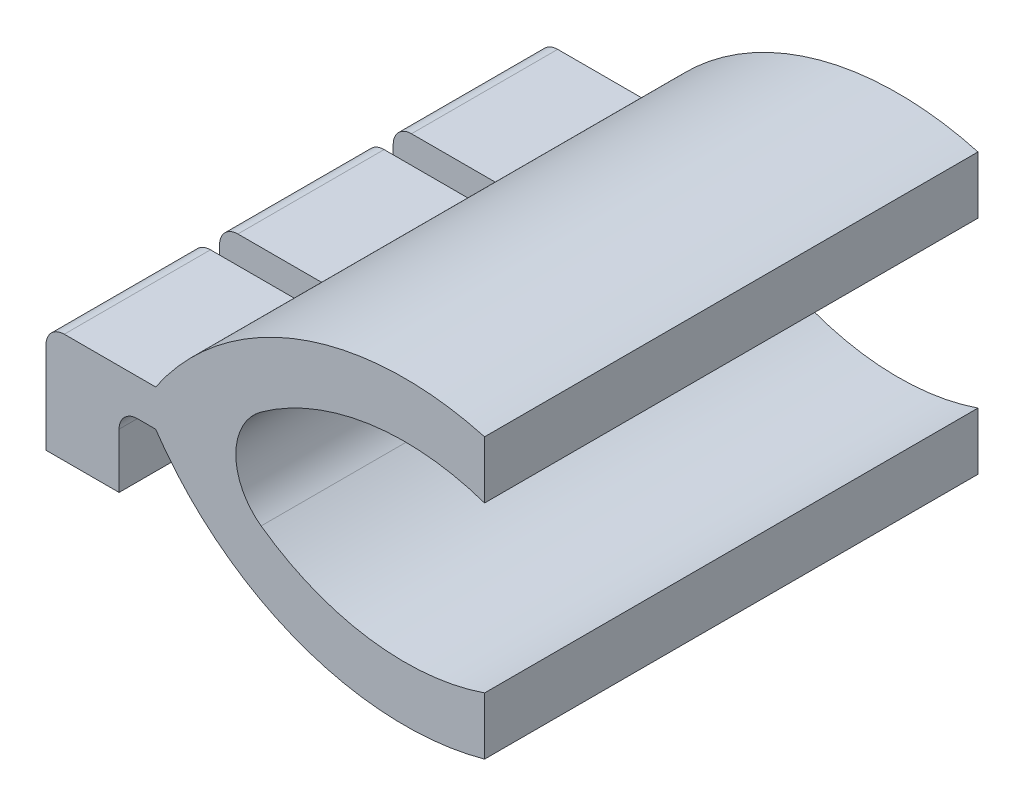
ISO-10303-21;
HEADER;
FILE_DESCRIPTION(('STEP AP214'),'2;1');
FILE_NAME('part.step','',(''),(''),'','','');
FILE_SCHEMA(('AUTOMOTIVE_DESIGN { 1 0 10303 214 1 1 1 1 }'));
ENDSEC;
DATA;
#1=APPLICATION_CONTEXT('core data for automotive mechanical design processes');
#2=APPLICATION_PROTOCOL_DEFINITION('international standard','automotive_design',2000,#1);
#3=PRODUCT_CONTEXT('',#1,'mechanical');
#4=PRODUCT('Part','Part','',(#3));
#5=PRODUCT_RELATED_PRODUCT_CATEGORY('part','',(#4));
#6=PRODUCT_DEFINITION_FORMATION('','',#4);
#7=PRODUCT_DEFINITION_CONTEXT('part definition',#1,'design');
#8=PRODUCT_DEFINITION('design','',#6,#7);
#9=PRODUCT_DEFINITION_SHAPE('','',#8);
#10=(LENGTH_UNIT() NAMED_UNIT(*) SI_UNIT(.MILLI.,.METRE.));
#11=(NAMED_UNIT(*) PLANE_ANGLE_UNIT() SI_UNIT($,.RADIAN.));
#12=(NAMED_UNIT(*) SI_UNIT($,.STERADIAN.) SOLID_ANGLE_UNIT());
#13=UNCERTAINTY_MEASURE_WITH_UNIT(LENGTH_MEASURE(1.E-05),#10,'distance_accuracy_value','');
#14=(GEOMETRIC_REPRESENTATION_CONTEXT(3) GLOBAL_UNCERTAINTY_ASSIGNED_CONTEXT((#13)) GLOBAL_UNIT_ASSIGNED_CONTEXT((#10,
#11,#12)) REPRESENTATION_CONTEXT('',''));
#15=CARTESIAN_POINT('',(0.,0.,0.));
#16=DIRECTION('',(0.,0.,1.));
#17=DIRECTION('',(1.,0.,0.));
#18=AXIS2_PLACEMENT_3D('',#15,#16,#17);
#19=CARTESIAN_POINT('',(-12.734069529105,0.999999999999999,27.));
#20=DIRECTION('',(0.,-1.,0.));
#21=DIRECTION('',(1.,0.,0.));
#22=AXIS2_PLACEMENT_3D('',#19,#20,#21);
#23=PLANE('',#22);
#24=DIRECTION('',(-1.,0.,0.));
#25=VECTOR('',#24,1.);
#26=CARTESIAN_POINT('',(-12.734069529105,0.999999999999999,9.5));
#27=LINE('',#26,#25);
#28=CARTESIAN_POINT('',(-12.734069529105,0.999999999999999,9.5));
#29=VERTEX_POINT('',#28);
#30=CARTESIAN_POINT('',(-17.734069529105,1.,9.5));
#31=VERTEX_POINT('',#30);
#32=EDGE_CURVE('E331',#29,#31,#27,.T.);
#33=ORIENTED_EDGE('',*,*,#32,.T.);
#34=DIRECTION('',(0.,0.,-1.));
#35=VECTOR('',#34,1.);
#36=CARTESIAN_POINT('',(-17.734069529105,1.,27.));
#37=LINE('',#36,#35);
#38=CARTESIAN_POINT('',(-17.734069529105,1.,17.5));
#39=VERTEX_POINT('',#38);
#40=EDGE_CURVE('E461',#31,#39,#37,.F.);
#41=ORIENTED_EDGE('',*,*,#40,.T.);
#42=DIRECTION('',(1.,0.,0.));
#43=VECTOR('',#42,1.);
#44=CARTESIAN_POINT('',(-12.734069529105,0.999999999999999,17.5));
#45=LINE('',#44,#43);
#46=CARTESIAN_POINT('',(-12.734069529105,0.999999999999999,17.5));
#47=VERTEX_POINT('',#46);
#48=EDGE_CURVE('E244',#39,#47,#45,.T.);
#49=ORIENTED_EDGE('',*,*,#48,.T.);
#50=DIRECTION('',(0.,0.,-1.));
#51=VECTOR('',#50,1.);
#52=CARTESIAN_POINT('',(-12.734069529105,0.999999999999999,27.));
#53=LINE('',#52,#51);
#54=EDGE_CURVE('E436',#47,#29,#53,.T.);
#55=ORIENTED_EDGE('',*,*,#54,.T.);
#56=EDGE_LOOP('',(#33,#41,#49,#55));
#57=FACE_BOUND('',#56,.T.);
#58=ADVANCED_FACE('F33',(#57),#23,.F.);
#59=DIRECTION('',(-1.,0.,0.));
#60=VECTOR('',#59,1.);
#61=CARTESIAN_POINT('',(-12.734069529105,0.999999999999999,19.));
#62=LINE('',#61,#60);
#63=CARTESIAN_POINT('',(-12.734069529105,0.999999999999999,19.));
#64=VERTEX_POINT('',#63);
#65=CARTESIAN_POINT('',(-17.734069529105,1.,19.));
#66=VERTEX_POINT('',#65);
#67=EDGE_CURVE('E264',#64,#66,#62,.T.);
#68=ORIENTED_EDGE('',*,*,#67,.T.);
#69=DIRECTION('',(0.,0.,-1.));
#70=VECTOR('',#69,1.);
#71=CARTESIAN_POINT('',(-17.734069529105,1.,27.));
#72=LINE('',#71,#70);
#73=CARTESIAN_POINT('',(-17.734069529105,1.,27.));
#74=VERTEX_POINT('',#73);
#75=EDGE_CURVE('E452',#66,#74,#72,.F.);
#76=ORIENTED_EDGE('',*,*,#75,.T.);
#77=DIRECTION('',(-1.,0.,0.));
#78=VECTOR('',#77,1.);
#79=CARTESIAN_POINT('',(-12.734069529105,0.999999999999999,27.));
#80=LINE('',#79,#78);
#81=CARTESIAN_POINT('',(-12.734069529105,0.999999999999999,27.));
#82=VERTEX_POINT('',#81);
#83=EDGE_CURVE('E351',#82,#74,#80,.T.);
#84=ORIENTED_EDGE('',*,*,#83,.F.);
#85=EDGE_CURVE('E441',#82,#64,#53,.T.);
#86=ORIENTED_EDGE('',*,*,#85,.T.);
#87=EDGE_LOOP('',(#68,#76,#84,#86));
#88=FACE_BOUND('',#87,.T.);
#89=ADVANCED_FACE('F541',(#88),#23,.F.);
#90=CARTESIAN_POINT('',(-18.734069529105,1.,27.));
#91=DIRECTION('',(1.,0.,0.));
#92=DIRECTION('',(0.,1.,0.));
#93=AXIS2_PLACEMENT_3D('',#90,#91,#92);
#94=PLANE('',#93);
#95=DIRECTION('',(0.,-1.,0.));
#96=VECTOR('',#95,1.);
#97=CARTESIAN_POINT('',(-18.734069529105,11.,17.5));
#98=LINE('',#97,#96);
#99=CARTESIAN_POINT('',(-18.734069529105,0.,17.5));
#100=VERTEX_POINT('',#99);
#101=CARTESIAN_POINT('',(-18.734069529105,-5.,17.5));
#102=VERTEX_POINT('',#101);
#103=EDGE_CURVE('E398',#100,#102,#98,.T.);
#104=ORIENTED_EDGE('',*,*,#103,.F.);
#105=DIRECTION('',(0.,0.,-1.));
#106=VECTOR('',#105,1.);
#107=CARTESIAN_POINT('',(-18.734069529105,0.,27.));
#108=LINE('',#107,#106);
#109=CARTESIAN_POINT('',(-18.734069529105,0.,9.5));
#110=VERTEX_POINT('',#109);
#111=EDGE_CURVE('E456',#100,#110,#108,.T.);
#112=ORIENTED_EDGE('',*,*,#111,.T.);
#113=DIRECTION('',(0.,1.,0.));
#114=VECTOR('',#113,1.);
#115=CARTESIAN_POINT('',(-18.734069529105,11.0236569041917,9.5));
#116=LINE('',#115,#114);
#117=CARTESIAN_POINT('',(-18.734069529105,-5.,9.5));
#118=VERTEX_POINT('',#117);
#119=EDGE_CURVE('E401',#118,#110,#116,.T.);
#120=ORIENTED_EDGE('',*,*,#119,.F.);
#121=DIRECTION('',(0.,0.,-1.));
#122=VECTOR('',#121,1.);
#123=CARTESIAN_POINT('',(-18.734069529105,-5.,27.));
#124=LINE('',#123,#122);
#125=EDGE_CURVE('E506',#102,#118,#124,.T.);
#126=ORIENTED_EDGE('',*,*,#125,.F.);
#127=EDGE_LOOP('',(#104,#112,#120,#126));
#128=FACE_BOUND('',#127,.T.);
#129=ADVANCED_FACE('F521',(#128),#94,.F.);
#130=DIRECTION('',(0.,-1.,0.));
#131=VECTOR('',#130,1.);
#132=CARTESIAN_POINT('',(-18.734069529105,1.,27.));
#133=LINE('',#132,#131);
#134=CARTESIAN_POINT('',(-18.734069529105,0.,27.));
#135=VERTEX_POINT('',#134);
#136=CARTESIAN_POINT('',(-18.734069529105,-5.,27.));
#137=VERTEX_POINT('',#136);
#138=EDGE_CURVE('E349',#135,#137,#133,.T.);
#139=ORIENTED_EDGE('',*,*,#138,.F.);
#140=DIRECTION('',(0.,0.,-1.));
#141=VECTOR('',#140,1.);
#142=CARTESIAN_POINT('',(-18.734069529105,0.,27.));
#143=LINE('',#142,#141);
#144=CARTESIAN_POINT('',(-18.734069529105,0.,19.));
#145=VERTEX_POINT('',#144);
#146=EDGE_CURVE('E444',#135,#145,#143,.T.);
#147=ORIENTED_EDGE('',*,*,#146,.T.);
#148=DIRECTION('',(0.,1.,0.));
#149=VECTOR('',#148,1.);
#150=CARTESIAN_POINT('',(-18.734069529105,-9.00000000000001,19.));
#151=LINE('',#150,#149);
#152=CARTESIAN_POINT('',(-18.734069529105,-5.,19.));
#153=VERTEX_POINT('',#152);
#154=EDGE_CURVE('E396',#153,#145,#151,.T.);
#155=ORIENTED_EDGE('',*,*,#154,.F.);
#156=EDGE_CURVE('E445',#137,#153,#124,.T.);
#157=ORIENTED_EDGE('',*,*,#156,.F.);
#158=EDGE_LOOP('',(#139,#147,#155,#157));
#159=FACE_BOUND('',#158,.T.);
#160=ADVANCED_FACE('F559',(#159),#94,.F.);
#161=CARTESIAN_POINT('',(-18.734069529105,-5.,27.));
#162=DIRECTION('',(0.,1.,0.));
#163=DIRECTION('',(0.,0.,1.));
#164=AXIS2_PLACEMENT_3D('',#161,#162,#163);
#165=PLANE('',#164);
#166=ORIENTED_EDGE('',*,*,#125,.T.);
#167=DIRECTION('',(1.,0.,0.));
#168=VECTOR('',#167,1.);
#169=CARTESIAN_POINT('',(-18.734069529105,-5.,9.5));
#170=LINE('',#169,#168);
#171=CARTESIAN_POINT('',(-14.734069529105,-5.,9.5));
#172=VERTEX_POINT('',#171);
#173=EDGE_CURVE('E358',#118,#172,#170,.T.);
#174=ORIENTED_EDGE('',*,*,#173,.T.);
#175=DIRECTION('',(0.,0.,-1.));
#176=VECTOR('',#175,1.);
#177=CARTESIAN_POINT('',(-14.734069529105,-5.,27.));
#178=LINE('',#177,#176);
#179=CARTESIAN_POINT('',(-14.734069529105,-5.,17.5));
#180=VERTEX_POINT('',#179);
#181=EDGE_CURVE('E272',#180,#172,#178,.T.);
#182=ORIENTED_EDGE('',*,*,#181,.F.);
#183=DIRECTION('',(-1.,0.,0.));
#184=VECTOR('',#183,1.);
#185=CARTESIAN_POINT('',(-18.734069529105,-5.,17.5));
#186=LINE('',#185,#184);
#187=EDGE_CURVE('E385',#180,#102,#186,.T.);
#188=ORIENTED_EDGE('',*,*,#187,.T.);
#189=EDGE_LOOP('',(#166,#174,#182,#188));
#190=FACE_BOUND('',#189,.T.);
#191=ADVANCED_FACE('F516',(#190),#165,.F.);
#192=ORIENTED_EDGE('',*,*,#156,.T.);
#193=DIRECTION('',(1.,0.,0.));
#194=VECTOR('',#193,1.);
#195=CARTESIAN_POINT('',(-18.734069529105,-5.,19.));
#196=LINE('',#195,#194);
#197=CARTESIAN_POINT('',(-14.734069529105,-5.,19.));
#198=VERTEX_POINT('',#197);
#199=EDGE_CURVE('E379',#153,#198,#196,.T.);
#200=ORIENTED_EDGE('',*,*,#199,.T.);
#201=CARTESIAN_POINT('',(-14.734069529105,-5.,27.));
#202=VERTEX_POINT('',#201);
#203=EDGE_CURVE('E274',#202,#198,#178,.T.);
#204=ORIENTED_EDGE('',*,*,#203,.F.);
#205=DIRECTION('',(1.,0.,0.));
#206=VECTOR('',#205,1.);
#207=CARTESIAN_POINT('',(-18.734069529105,-5.,27.));
#208=LINE('',#207,#206);
#209=EDGE_CURVE('E347',#137,#202,#208,.T.);
#210=ORIENTED_EDGE('',*,*,#209,.F.);
#211=EDGE_LOOP('',(#192,#200,#204,#210));
#212=FACE_BOUND('',#211,.T.);
#213=ADVANCED_FACE('F503',(#212),#165,.F.);
#214=CARTESIAN_POINT('',(-14.734069529105,-5.,27.));
#215=DIRECTION('',(-1.,0.,0.));
#216=DIRECTION('',(0.,0.,1.));
#217=AXIS2_PLACEMENT_3D('',#214,#215,#216);
#218=PLANE('',#217);
#219=DIRECTION('',(0.,1.,0.));
#220=VECTOR('',#219,1.);
#221=CARTESIAN_POINT('',(-14.734069529105,-5.,9.5));
#222=LINE('',#221,#220);
#223=CARTESIAN_POINT('',(-14.734069529105,-2.,9.5));
#224=VERTEX_POINT('',#223);
#225=EDGE_CURVE('E361',#172,#224,#222,.T.);
#226=ORIENTED_EDGE('',*,*,#225,.T.);
#227=DIRECTION('',(0.,0.,-1.));
#228=VECTOR('',#227,1.);
#229=CARTESIAN_POINT('',(-14.734069529105,-2.,17.5));
#230=LINE('',#229,#228);
#231=CARTESIAN_POINT('',(-14.734069529105,-2.,17.5));
#232=VERTEX_POINT('',#231);
#233=EDGE_CURVE('E478',#224,#232,#230,.F.);
#234=ORIENTED_EDGE('',*,*,#233,.T.);
#235=DIRECTION('',(0.,-1.,0.));
#236=VECTOR('',#235,1.);
#237=CARTESIAN_POINT('',(-14.734069529105,-5.,17.5));
#238=LINE('',#237,#236);
#239=EDGE_CURVE('E388',#232,#180,#238,.T.);
#240=ORIENTED_EDGE('',*,*,#239,.T.);
#241=ORIENTED_EDGE('',*,*,#181,.T.);
#242=EDGE_LOOP('',(#226,#234,#240,#241));
#243=FACE_BOUND('',#242,.T.);
#244=ADVANCED_FACE('F510',(#243),#218,.F.);
#245=DIRECTION('',(0.,1.,0.));
#246=VECTOR('',#245,1.);
#247=CARTESIAN_POINT('',(-14.734069529105,-5.,19.));
#248=LINE('',#247,#246);
#249=CARTESIAN_POINT('',(-14.734069529105,-2.,19.));
#250=VERTEX_POINT('',#249);
#251=EDGE_CURVE('E243',#198,#250,#248,.T.);
#252=ORIENTED_EDGE('',*,*,#251,.T.);
#253=DIRECTION('',(0.,0.,-1.));
#254=VECTOR('',#253,1.);
#255=CARTESIAN_POINT('',(-14.734069529105,-2.,27.));
#256=LINE('',#255,#254);
#257=CARTESIAN_POINT('',(-14.734069529105,-2.,27.));
#258=VERTEX_POINT('',#257);
#259=EDGE_CURVE('E481',#250,#258,#256,.F.);
#260=ORIENTED_EDGE('',*,*,#259,.T.);
#261=DIRECTION('',(0.,1.,0.));
#262=VECTOR('',#261,1.);
#263=CARTESIAN_POINT('',(-14.734069529105,-5.,27.));
#264=LINE('',#263,#262);
#265=EDGE_CURVE('E344',#202,#258,#264,.T.);
#266=ORIENTED_EDGE('',*,*,#265,.F.);
#267=ORIENTED_EDGE('',*,*,#203,.T.);
#268=EDGE_LOOP('',(#252,#260,#266,#267));
#269=FACE_BOUND('',#268,.T.);
#270=ADVANCED_FACE('F492',(#269),#218,.F.);
#271=CARTESIAN_POINT('',(-14.734069529105,-0.999999999999999,27.));
#272=DIRECTION('',(0.,1.,0.));
#273=DIRECTION('',(0.,0.,1.));
#274=AXIS2_PLACEMENT_3D('',#271,#272,#273);
#275=PLANE('',#274);
#276=DIRECTION('',(-1.,0.,0.));
#277=VECTOR('',#276,1.);
#278=CARTESIAN_POINT('',(-14.734069529105,-0.999999999999999,17.5));
#279=LINE('',#278,#277);
#280=CARTESIAN_POINT('',(-12.734069529105,-0.999999999999997,17.5));
#281=VERTEX_POINT('',#280);
#282=CARTESIAN_POINT('',(-13.734069529105,-0.999999999999999,17.5));
#283=VERTEX_POINT('',#282);
#284=EDGE_CURVE('E390',#281,#283,#279,.T.);
#285=ORIENTED_EDGE('',*,*,#284,.T.);
#286=DIRECTION('',(0.,0.,-1.));
#287=VECTOR('',#286,1.);
#288=CARTESIAN_POINT('',(-13.734069529105,-0.999999999999999,9.5));
#289=LINE('',#288,#287);
#290=CARTESIAN_POINT('',(-13.734069529105,-0.999999999999999,9.5));
#291=VERTEX_POINT('',#290);
#292=EDGE_CURVE('E428',#283,#291,#289,.T.);
#293=ORIENTED_EDGE('',*,*,#292,.T.);
#294=DIRECTION('',(1.,0.,0.));
#295=VECTOR('',#294,1.);
#296=CARTESIAN_POINT('',(-14.734069529105,-0.999999999999999,9.5));
#297=LINE('',#296,#295);
#298=CARTESIAN_POINT('',(-12.734069529105,-0.999999999999992,9.5));
#299=VERTEX_POINT('',#298);
#300=EDGE_CURVE('E364',#291,#299,#297,.T.);
#301=ORIENTED_EDGE('',*,*,#300,.T.);
#302=DIRECTION('',(0.,0.,-1.));
#303=VECTOR('',#302,1.);
#304=CARTESIAN_POINT('',(-12.734069529105,-0.999999999999997,27.));
#305=LINE('',#304,#303);
#306=EDGE_CURVE('E259',#281,#299,#305,.T.);
#307=ORIENTED_EDGE('',*,*,#306,.F.);
#308=EDGE_LOOP('',(#285,#293,#301,#307));
#309=FACE_BOUND('',#308,.T.);
#310=ADVANCED_FACE('F424',(#309),#275,.F.);
#311=DIRECTION('',(1.,0.,0.));
#312=VECTOR('',#311,1.);
#313=CARTESIAN_POINT('',(-14.734069529105,-0.999999999999999,27.));
#314=LINE('',#313,#312);
#315=CARTESIAN_POINT('',(-13.734069529105,-0.999999999999999,27.));
#316=VERTEX_POINT('',#315);
#317=CARTESIAN_POINT('',(-12.734069529105,-0.999999999999997,27.));
#318=VERTEX_POINT('',#317);
#319=EDGE_CURVE('E342',#316,#318,#314,.T.);
#320=ORIENTED_EDGE('',*,*,#319,.F.);
#321=DIRECTION('',(0.,0.,-1.));
#322=VECTOR('',#321,1.);
#323=CARTESIAN_POINT('',(-13.734069529105,-0.999999999999999,19.));
#324=LINE('',#323,#322);
#325=CARTESIAN_POINT('',(-13.734069529105,-0.999999999999999,19.));
#326=VERTEX_POINT('',#325);
#327=EDGE_CURVE('E240',#316,#326,#324,.T.);
#328=ORIENTED_EDGE('',*,*,#327,.T.);
#329=DIRECTION('',(1.,0.,0.));
#330=VECTOR('',#329,1.);
#331=CARTESIAN_POINT('',(-14.734069529105,-0.999999999999999,19.));
#332=LINE('',#331,#330);
#333=CARTESIAN_POINT('',(-12.734069529105,-0.999999999999992,19.));
#334=VERTEX_POINT('',#333);
#335=EDGE_CURVE('E232',#326,#334,#332,.T.);
#336=ORIENTED_EDGE('',*,*,#335,.T.);
#337=EDGE_CURVE('E237',#318,#334,#305,.T.);
#338=ORIENTED_EDGE('',*,*,#337,.F.);
#339=EDGE_LOOP('',(#320,#328,#336,#338));
#340=FACE_BOUND('',#339,.T.);
#341=ADVANCED_FACE('F235',(#340),#275,.F.);
#342=CARTESIAN_POINT('',(0.894148142792659,-8.22978085201658,27.));
#343=DIRECTION('',(0.,0.,-1.));
#344=DIRECTION('',(-1.,0.,0.));
#345=AXIS2_PLACEMENT_3D('',#342,#343,#344);
#346=CYLINDRICAL_SURFACE('',#345,16.4595617040332);
#347=CARTESIAN_POINT('',(0.894148142792659,-8.22978085201658,0.));
#348=DIRECTION('',(0.,0.,1.));
#349=DIRECTION('',(1.,0.,0.));
#350=AXIS2_PLACEMENT_3D('',#347,#348,#349);
#351=CIRCLE('',#350,16.4595617040332);
#352=CARTESIAN_POINT('',(5.26593047089502,7.63857415928081,0.));
#353=VERTEX_POINT('',#352);
#354=CARTESIAN_POINT('',(-12.734069529105,0.999999999999999,0.));
#355=VERTEX_POINT('',#354);
#356=EDGE_CURVE('E328',#353,#355,#351,.T.);
#357=ORIENTED_EDGE('',*,*,#356,.T.);
#358=CARTESIAN_POINT('',(-12.734069529105,0.999999999999999,8.));
#359=VERTEX_POINT('',#358);
#360=EDGE_CURVE('E437',#359,#355,#53,.T.);
#361=ORIENTED_EDGE('',*,*,#360,.F.);
#362=DIRECTION('',(0.,0.,1.));
#363=VECTOR('',#362,1.);
#364=CARTESIAN_POINT('',(-12.734069529105,0.999999999999999,27.));
#365=LINE('',#364,#363);
#366=EDGE_CURVE('E375',#359,#29,#365,.T.);
#367=ORIENTED_EDGE('',*,*,#366,.T.);
#368=ORIENTED_EDGE('',*,*,#54,.F.);
#369=DIRECTION('',(0.,0.,-1.));
#370=VECTOR('',#369,1.);
#371=CARTESIAN_POINT('',(-12.734069529105,0.999999999999999,27.));
#372=LINE('',#371,#370);
#373=EDGE_CURVE('E393',#64,#47,#372,.T.);
#374=ORIENTED_EDGE('',*,*,#373,.F.);
#375=ORIENTED_EDGE('',*,*,#85,.F.);
#376=CARTESIAN_POINT('',(0.894148142792659,-8.22978085201658,27.));
#377=DIRECTION('',(0.,0.,1.));
#378=DIRECTION('',(1.,0.,0.));
#379=AXIS2_PLACEMENT_3D('',#376,#377,#378);
#380=CIRCLE('',#379,16.4595617040332);
#381=CARTESIAN_POINT('',(5.26593047089502,7.63857415928081,27.));
#382=VERTEX_POINT('',#381);
#383=EDGE_CURVE('E305',#382,#82,#380,.T.);
#384=ORIENTED_EDGE('',*,*,#383,.F.);
#385=DIRECTION('',(0.,0.,-1.));
#386=VECTOR('',#385,1.);
#387=CARTESIAN_POINT('',(5.26593047089502,7.63857415928081,27.));
#388=LINE('',#387,#386);
#389=EDGE_CURVE('E299',#382,#353,#388,.T.);
#390=ORIENTED_EDGE('',*,*,#389,.T.);
#391=EDGE_LOOP('',(#357,#361,#367,#368,#374,#375,#384,#390));
#392=FACE_BOUND('',#391,.T.);
#393=ADVANCED_FACE('F435',(#392),#346,.T.);
#394=DIRECTION('',(-1.,0.,0.));
#395=VECTOR('',#394,1.);
#396=CARTESIAN_POINT('',(-12.734069529105,0.999999999999999,0.));
#397=LINE('',#396,#395);
#398=CARTESIAN_POINT('',(-17.734069529105,1.,0.));
#399=VERTEX_POINT('',#398);
#400=EDGE_CURVE('E325',#355,#399,#397,.T.);
#401=ORIENTED_EDGE('',*,*,#400,.T.);
#402=DIRECTION('',(0.,0.,-1.));
#403=VECTOR('',#402,1.);
#404=CARTESIAN_POINT('',(-17.734069529105,1.,27.));
#405=LINE('',#404,#403);
#406=CARTESIAN_POINT('',(-17.734069529105,1.,8.));
#407=VERTEX_POINT('',#406);
#408=EDGE_CURVE('E470',#399,#407,#405,.F.);
#409=ORIENTED_EDGE('',*,*,#408,.T.);
#410=DIRECTION('',(1.,0.,0.));
#411=VECTOR('',#410,1.);
#412=CARTESIAN_POINT('',(-12.734069529105,0.999999999999999,8.));
#413=LINE('',#412,#411);
#414=EDGE_CURVE('E366',#407,#359,#413,.T.);
#415=ORIENTED_EDGE('',*,*,#414,.T.);
#416=ORIENTED_EDGE('',*,*,#360,.T.);
#417=EDGE_LOOP('',(#401,#409,#415,#416));
#418=FACE_BOUND('',#417,.T.);
#419=ADVANCED_FACE('F543',(#418),#23,.F.);
#420=DIRECTION('',(0.,-1.,0.));
#421=VECTOR('',#420,1.);
#422=CARTESIAN_POINT('',(-18.734069529105,-8.97634309580835,8.));
#423=LINE('',#422,#421);
#424=CARTESIAN_POINT('',(-18.734069529105,0.,8.));
#425=VERTEX_POINT('',#424);
#426=CARTESIAN_POINT('',(-18.734069529105,-5.,8.));
#427=VERTEX_POINT('',#426);
#428=EDGE_CURVE('E265',#425,#427,#423,.T.);
#429=ORIENTED_EDGE('',*,*,#428,.F.);
#430=DIRECTION('',(0.,0.,-1.));
#431=VECTOR('',#430,1.);
#432=CARTESIAN_POINT('',(-18.734069529105,0.,27.));
#433=LINE('',#432,#431);
#434=CARTESIAN_POINT('',(-18.734069529105,0.,0.));
#435=VERTEX_POINT('',#434);
#436=EDGE_CURVE('E465',#425,#435,#433,.T.);
#437=ORIENTED_EDGE('',*,*,#436,.T.);
#438=DIRECTION('',(0.,-1.,0.));
#439=VECTOR('',#438,1.);
#440=CARTESIAN_POINT('',(-18.734069529105,1.,0.));
#441=LINE('',#440,#439);
#442=CARTESIAN_POINT('',(-18.734069529105,-5.,0.));
#443=VERTEX_POINT('',#442);
#444=EDGE_CURVE('E323',#435,#443,#441,.T.);
#445=ORIENTED_EDGE('',*,*,#444,.T.);
#446=EDGE_CURVE('E504',#427,#443,#124,.T.);
#447=ORIENTED_EDGE('',*,*,#446,.F.);
#448=EDGE_LOOP('',(#429,#437,#445,#447));
#449=FACE_BOUND('',#448,.T.);
#450=ADVANCED_FACE('F551',(#449),#94,.F.);
#451=CARTESIAN_POINT('',(-14.734069529105,-5.,8.));
#452=VERTEX_POINT('',#451);
#453=CARTESIAN_POINT('',(-14.734069529105,-5.,0.));
#454=VERTEX_POINT('',#453);
#455=EDGE_CURVE('E270',#452,#454,#178,.T.);
#456=ORIENTED_EDGE('',*,*,#455,.F.);
#457=DIRECTION('',(-1.,0.,0.));
#458=VECTOR('',#457,1.);
#459=CARTESIAN_POINT('',(-18.734069529105,-5.,8.));
#460=LINE('',#459,#458);
#461=EDGE_CURVE('E368',#452,#427,#460,.T.);
#462=ORIENTED_EDGE('',*,*,#461,.T.);
#463=ORIENTED_EDGE('',*,*,#446,.T.);
#464=DIRECTION('',(1.,0.,0.));
#465=VECTOR('',#464,1.);
#466=CARTESIAN_POINT('',(-18.734069529105,-5.,0.));
#467=LINE('',#466,#465);
#468=EDGE_CURVE('E320',#443,#454,#467,.T.);
#469=ORIENTED_EDGE('',*,*,#468,.T.);
#470=EDGE_LOOP('',(#456,#462,#463,#469));
#471=FACE_BOUND('',#470,.T.);
#472=ADVANCED_FACE('F557',(#471),#165,.F.);
#473=DIRECTION('',(0.,1.,0.));
#474=VECTOR('',#473,1.);
#475=CARTESIAN_POINT('',(-14.734069529105,-5.,0.));
#476=LINE('',#475,#474);
#477=CARTESIAN_POINT('',(-14.734069529105,-2.,0.));
#478=VERTEX_POINT('',#477);
#479=EDGE_CURVE('E318',#454,#478,#476,.T.);
#480=ORIENTED_EDGE('',*,*,#479,.T.);
#481=DIRECTION('',(0.,0.,-1.));
#482=VECTOR('',#481,1.);
#483=CARTESIAN_POINT('',(-14.734069529105,-2.,8.));
#484=LINE('',#483,#482);
#485=CARTESIAN_POINT('',(-14.734069529105,-2.,8.));
#486=VERTEX_POINT('',#485);
#487=EDGE_CURVE('E56',#478,#486,#484,.F.);
#488=ORIENTED_EDGE('',*,*,#487,.T.);
#489=DIRECTION('',(0.,-1.,0.));
#490=VECTOR('',#489,1.);
#491=CARTESIAN_POINT('',(-14.734069529105,-5.,8.));
#492=LINE('',#491,#490);
#493=EDGE_CURVE('E371',#486,#452,#492,.T.);
#494=ORIENTED_EDGE('',*,*,#493,.T.);
#495=ORIENTED_EDGE('',*,*,#455,.T.);
#496=EDGE_LOOP('',(#480,#488,#494,#495));
#497=FACE_BOUND('',#496,.T.);
#498=ADVANCED_FACE('F576',(#497),#218,.F.);
#499=DIRECTION('',(-1.,0.,0.));
#500=VECTOR('',#499,1.);
#501=CARTESIAN_POINT('',(-14.734069529105,-0.999999999999999,8.));
#502=LINE('',#501,#500);
#503=CARTESIAN_POINT('',(-12.734069529105,-0.999999999999997,8.));
#504=VERTEX_POINT('',#503);
#505=CARTESIAN_POINT('',(-13.734069529105,-0.999999999999999,8.));
#506=VERTEX_POINT('',#505);
#507=EDGE_CURVE('E373',#504,#506,#502,.T.);
#508=ORIENTED_EDGE('',*,*,#507,.T.);
#509=DIRECTION('',(0.,0.,-1.));
#510=VECTOR('',#509,1.);
#511=CARTESIAN_POINT('',(-13.734069529105,-0.999999999999999,0.));
#512=LINE('',#511,#510);
#513=CARTESIAN_POINT('',(-13.734069529105,-0.999999999999999,0.));
#514=VERTEX_POINT('',#513);
#515=EDGE_CURVE('E474',#506,#514,#512,.T.);
#516=ORIENTED_EDGE('',*,*,#515,.T.);
#517=DIRECTION('',(1.,0.,0.));
#518=VECTOR('',#517,1.);
#519=CARTESIAN_POINT('',(-14.734069529105,-0.999999999999999,0.));
#520=LINE('',#519,#518);
#521=CARTESIAN_POINT('',(-12.734069529105,-0.999999999999997,0.));
#522=VERTEX_POINT('',#521);
#523=EDGE_CURVE('E316',#514,#522,#520,.T.);
#524=ORIENTED_EDGE('',*,*,#523,.T.);
#525=EDGE_CURVE('E271',#504,#522,#305,.T.);
#526=ORIENTED_EDGE('',*,*,#525,.F.);
#527=EDGE_LOOP('',(#508,#516,#524,#526));
#528=FACE_BOUND('',#527,.T.);
#529=ADVANCED_FACE('F420',(#528),#275,.F.);
#530=CARTESIAN_POINT('',(0.894148142792659,8.22978085201658,27.));
#531=DIRECTION('',(0.,0.,-1.));
#532=DIRECTION('',(-1.,0.,0.));
#533=AXIS2_PLACEMENT_3D('',#530,#531,#532);
#534=CYLINDRICAL_SURFACE('',#533,16.4595617040332);
#535=CARTESIAN_POINT('',(0.894148142792659,8.22978085201658,0.));
#536=DIRECTION('',(0.,0.,1.));
#537=DIRECTION('',(-1.,0.,0.));
#538=AXIS2_PLACEMENT_3D('',#535,#536,#537);
#539=CIRCLE('',#538,16.4595617040332);
#540=CARTESIAN_POINT('',(5.26593047089502,-7.63857415928081,0.));
#541=VERTEX_POINT('',#540);
#542=EDGE_CURVE('E314',#522,#541,#539,.T.);
#543=ORIENTED_EDGE('',*,*,#542,.T.);
#544=DIRECTION('',(0.,0.,-1.));
#545=VECTOR('',#544,1.);
#546=CARTESIAN_POINT('',(5.26593047089502,-7.63857415928081,27.));
#547=LINE('',#546,#545);
#548=CARTESIAN_POINT('',(5.26593047089502,-7.63857415928081,27.));
#549=VERTEX_POINT('',#548);
#550=EDGE_CURVE('E278',#549,#541,#547,.T.);
#551=ORIENTED_EDGE('',*,*,#550,.F.);
#552=CARTESIAN_POINT('',(0.894148142792659,8.22978085201658,27.));
#553=DIRECTION('',(0.,0.,1.));
#554=DIRECTION('',(-1.,0.,0.));
#555=AXIS2_PLACEMENT_3D('',#552,#553,#554);
#556=CIRCLE('',#555,16.4595617040332);
#557=EDGE_CURVE('E269',#318,#549,#556,.T.);
#558=ORIENTED_EDGE('',*,*,#557,.F.);
#559=ORIENTED_EDGE('',*,*,#337,.T.);
#560=EDGE_CURVE('E249',#334,#281,#305,.T.);
#561=ORIENTED_EDGE('',*,*,#560,.T.);
#562=ORIENTED_EDGE('',*,*,#306,.T.);
#563=EDGE_CURVE('E277',#299,#504,#305,.T.);
#564=ORIENTED_EDGE('',*,*,#563,.T.);
#565=ORIENTED_EDGE('',*,*,#525,.T.);
#566=EDGE_LOOP('',(#543,#551,#558,#559,#561,#562,#564,#565));
#567=FACE_BOUND('',#566,.T.);
#568=ADVANCED_FACE('F267',(#567),#534,.T.);
#569=CARTESIAN_POINT('',(5.26593047089502,-4.5,27.));
#570=DIRECTION('',(-1.,0.,0.));
#571=DIRECTION('',(0.,-1.,0.));
#572=AXIS2_PLACEMENT_3D('',#569,#570,#571);
#573=PLANE('',#572);
#574=DIRECTION('',(0.,1.,0.));
#575=VECTOR('',#574,1.);
#576=CARTESIAN_POINT('',(5.26593047089502,-4.5,0.));
#577=LINE('',#576,#575);
#578=CARTESIAN_POINT('',(5.26593047089502,-4.5,0.));
#579=VERTEX_POINT('',#578);
#580=EDGE_CURVE('E312',#541,#579,#577,.T.);
#581=ORIENTED_EDGE('',*,*,#580,.T.);
#582=DIRECTION('',(0.,0.,-1.));
#583=VECTOR('',#582,1.);
#584=CARTESIAN_POINT('',(5.26593047089502,-4.5,27.));
#585=LINE('',#584,#583);
#586=CARTESIAN_POINT('',(5.26593047089502,-4.5,27.));
#587=VERTEX_POINT('',#586);
#588=EDGE_CURVE('E283',#587,#579,#585,.T.);
#589=ORIENTED_EDGE('',*,*,#588,.F.);
#590=DIRECTION('',(0.,1.,0.));
#591=VECTOR('',#590,1.);
#592=CARTESIAN_POINT('',(5.26593047089502,-4.5,27.));
#593=LINE('',#592,#591);
#594=EDGE_CURVE('E339',#549,#587,#593,.T.);
#595=ORIENTED_EDGE('',*,*,#594,.F.);
#596=ORIENTED_EDGE('',*,*,#550,.T.);
#597=EDGE_LOOP('',(#581,#589,#595,#596));
#598=FACE_BOUND('',#597,.T.);
#599=ADVANCED_FACE('F579',(#598),#573,.F.);
#600=CARTESIAN_POINT('',(0.894148142792659,8.22978085201658,27.));
#601=DIRECTION('',(0.,0.,-1.));
#602=DIRECTION('',(-1.,0.,0.));
#603=AXIS2_PLACEMENT_3D('',#600,#601,#602);
#604=CYLINDRICAL_SURFACE('',#603,13.4595617040332);
#605=CARTESIAN_POINT('',(0.894148142792659,8.22978085201658,0.));
#606=DIRECTION('',(0.,0.,-1.));
#607=DIRECTION('',(-1.,0.,0.));
#608=AXIS2_PLACEMENT_3D('',#605,#606,#607);
#609=CIRCLE('',#608,13.4595617040332);
#610=CARTESIAN_POINT('',(-6.96126491573677,-2.69964214028092,0.));
#611=VERTEX_POINT('',#610);
#612=EDGE_CURVE('E310',#579,#611,#609,.T.);
#613=ORIENTED_EDGE('',*,*,#612,.T.);
#614=DIRECTION('',(0.,0.,-1.));
#615=VECTOR('',#614,1.);
#616=CARTESIAN_POINT('',(-6.96126491573677,-2.69964214028092,27.));
#617=LINE('',#616,#615);
#618=CARTESIAN_POINT('',(-6.96126491573677,-2.69964214028092,27.));
#619=VERTEX_POINT('',#618);
#620=EDGE_CURVE('E288',#619,#611,#617,.T.);
#621=ORIENTED_EDGE('',*,*,#620,.F.);
#622=CARTESIAN_POINT('',(0.894148142792659,8.22978085201658,27.));
#623=DIRECTION('',(0.,0.,-1.));
#624=DIRECTION('',(-1.,0.,0.));
#625=AXIS2_PLACEMENT_3D('',#622,#623,#624);
#626=CIRCLE('',#625,13.4595617040332);
#627=EDGE_CURVE('E337',#587,#619,#626,.T.);
#628=ORIENTED_EDGE('',*,*,#627,.F.);
#629=ORIENTED_EDGE('',*,*,#588,.T.);
#630=EDGE_LOOP('',(#613,#621,#628,#629));
#631=FACE_BOUND('',#630,.T.);
#632=ADVANCED_FACE('F585',(#631),#604,.F.);
#633=CARTESIAN_POINT('',(-5.02092422830391,0.,27.));
#634=DIRECTION('',(0.,0.,-1.));
#635=DIRECTION('',(-1.,0.,0.));
#636=AXIS2_PLACEMENT_3D('',#633,#634,#635);
#637=CYLINDRICAL_SURFACE('',#636,3.32460368598845);
#638=CARTESIAN_POINT('',(-5.02092422830391,0.,0.));
#639=DIRECTION('',(0.,0.,-1.));
#640=DIRECTION('',(-1.,0.,0.));
#641=AXIS2_PLACEMENT_3D('',#638,#639,#640);
#642=CIRCLE('',#641,3.32460368598845);
#643=CARTESIAN_POINT('',(-6.96126491573678,2.69964214028092,0.));
#644=VERTEX_POINT('',#643);
#645=EDGE_CURVE('E308',#611,#644,#642,.T.);
#646=ORIENTED_EDGE('',*,*,#645,.T.);
#647=DIRECTION('',(0.,0.,-1.));
#648=VECTOR('',#647,1.);
#649=CARTESIAN_POINT('',(-6.96126491573678,2.69964214028092,27.));
#650=LINE('',#649,#648);
#651=CARTESIAN_POINT('',(-6.96126491573678,2.69964214028092,27.));
#652=VERTEX_POINT('',#651);
#653=EDGE_CURVE('E293',#652,#644,#650,.T.);
#654=ORIENTED_EDGE('',*,*,#653,.F.);
#655=CARTESIAN_POINT('',(-5.02092422830391,0.,27.));
#656=DIRECTION('',(0.,0.,-1.));
#657=DIRECTION('',(-1.,0.,0.));
#658=AXIS2_PLACEMENT_3D('',#655,#656,#657);
#659=CIRCLE('',#658,3.32460368598845);
#660=EDGE_CURVE('E335',#619,#652,#659,.T.);
#661=ORIENTED_EDGE('',*,*,#660,.F.);
#662=ORIENTED_EDGE('',*,*,#620,.T.);
#663=EDGE_LOOP('',(#646,#654,#661,#662));
#664=FACE_BOUND('',#663,.T.);
#665=ADVANCED_FACE('F588',(#664),#637,.F.);
#666=CARTESIAN_POINT('',(0.894148142792659,-8.22978085201658,27.));
#667=DIRECTION('',(0.,0.,-1.));
#668=DIRECTION('',(-1.,0.,0.));
#669=AXIS2_PLACEMENT_3D('',#666,#667,#668);
#670=CYLINDRICAL_SURFACE('',#669,13.4595617040332);
#671=CARTESIAN_POINT('',(0.894148142792659,-8.22978085201658,0.));
#672=DIRECTION('',(0.,0.,-1.));
#673=DIRECTION('',(1.,0.,0.));
#674=AXIS2_PLACEMENT_3D('',#671,#672,#673);
#675=CIRCLE('',#674,13.4595617040332);
#676=CARTESIAN_POINT('',(5.26593047089502,4.5,0.));
#677=VERTEX_POINT('',#676);
#678=EDGE_CURVE('E306',#644,#677,#675,.T.);
#679=ORIENTED_EDGE('',*,*,#678,.T.);
#680=DIRECTION('',(0.,0.,-1.));
#681=VECTOR('',#680,1.);
#682=CARTESIAN_POINT('',(5.26593047089502,4.5,27.));
#683=LINE('',#682,#681);
#684=CARTESIAN_POINT('',(5.26593047089502,4.5,27.));
#685=VERTEX_POINT('',#684);
#686=EDGE_CURVE('E296',#685,#677,#683,.T.);
#687=ORIENTED_EDGE('',*,*,#686,.F.);
#688=CARTESIAN_POINT('',(0.894148142792659,-8.22978085201658,27.));
#689=DIRECTION('',(0.,0.,-1.));
#690=DIRECTION('',(1.,0.,0.));
#691=AXIS2_PLACEMENT_3D('',#688,#689,#690);
#692=CIRCLE('',#691,13.4595617040332);
#693=EDGE_CURVE('E333',#652,#685,#692,.T.);
#694=ORIENTED_EDGE('',*,*,#693,.F.);
#695=ORIENTED_EDGE('',*,*,#653,.T.);
#696=EDGE_LOOP('',(#679,#687,#694,#695));
#697=FACE_BOUND('',#696,.T.);
#698=ADVANCED_FACE('F593',(#697),#670,.F.);
#699=CARTESIAN_POINT('',(5.26593047089502,4.5,27.));
#700=DIRECTION('',(-1.,0.,0.));
#701=DIRECTION('',(0.,-1.,0.));
#702=AXIS2_PLACEMENT_3D('',#699,#700,#701);
#703=PLANE('',#702);
#704=DIRECTION('',(0.,1.,0.));
#705=VECTOR('',#704,1.);
#706=CARTESIAN_POINT('',(5.26593047089502,4.5,0.));
#707=LINE('',#706,#705);
#708=EDGE_CURVE('E303',#677,#353,#707,.T.);
#709=ORIENTED_EDGE('',*,*,#708,.T.);
#710=ORIENTED_EDGE('',*,*,#389,.F.);
#711=DIRECTION('',(0.,1.,0.));
#712=VECTOR('',#711,1.);
#713=CARTESIAN_POINT('',(5.26593047089502,4.5,27.));
#714=LINE('',#713,#712);
#715=EDGE_CURVE('E302',#685,#382,#714,.T.);
#716=ORIENTED_EDGE('',*,*,#715,.F.);
#717=ORIENTED_EDGE('',*,*,#686,.T.);
#718=EDGE_LOOP('',(#709,#710,#716,#717));
#719=FACE_BOUND('',#718,.T.);
#720=ADVANCED_FACE('F599',(#719),#703,.F.);
#721=CARTESIAN_POINT('',(0.894148142792659,-8.22978085201658,27.));
#722=DIRECTION('',(0.,0.,1.));
#723=DIRECTION('',(1.,0.,0.));
#724=AXIS2_PLACEMENT_3D('',#721,#722,#723);
#725=PLANE('',#724);
#726=ORIENTED_EDGE('',*,*,#83,.T.);
#727=CARTESIAN_POINT('',(-17.734069529105,0.,27.));
#728=DIRECTION('',(0.,0.,1.));
#729=DIRECTION('',(1.,0.,0.));
#730=AXIS2_PLACEMENT_3D('',#727,#728,#729);
#731=CIRCLE('',#730,1.);
#732=EDGE_CURVE('E454',#74,#135,#731,.T.);
#733=ORIENTED_EDGE('',*,*,#732,.T.);
#734=ORIENTED_EDGE('',*,*,#138,.T.);
#735=ORIENTED_EDGE('',*,*,#209,.T.);
#736=ORIENTED_EDGE('',*,*,#265,.T.);
#737=CARTESIAN_POINT('',(-13.734069529105,-2.,27.));
#738=DIRECTION('',(0.,0.,1.));
#739=DIRECTION('',(1.,0.,0.));
#740=AXIS2_PLACEMENT_3D('',#737,#738,#739);
#741=CIRCLE('',#740,1.);
#742=EDGE_CURVE('E11',#258,#316,#741,.F.);
#743=ORIENTED_EDGE('',*,*,#742,.T.);
#744=ORIENTED_EDGE('',*,*,#319,.T.);
#745=ORIENTED_EDGE('',*,*,#557,.T.);
#746=ORIENTED_EDGE('',*,*,#594,.T.);
#747=ORIENTED_EDGE('',*,*,#627,.T.);
#748=ORIENTED_EDGE('',*,*,#660,.T.);
#749=ORIENTED_EDGE('',*,*,#693,.T.);
#750=ORIENTED_EDGE('',*,*,#715,.T.);
#751=ORIENTED_EDGE('',*,*,#383,.T.);
#752=EDGE_LOOP('',(#726,#733,#734,#735,#736,#743,#744,#745,#746,#747,#748,#749,#750,#751));
#753=FACE_BOUND('',#752,.T.);
#754=ADVANCED_FACE('F497',(#753),#725,.T.);
#755=CARTESIAN_POINT('',(0.894148142792659,-8.22978085201658,0.));
#756=DIRECTION('',(0.,0.,1.));
#757=DIRECTION('',(1.,0.,0.));
#758=AXIS2_PLACEMENT_3D('',#755,#756,#757);
#759=PLANE('',#758);
#760=ORIENTED_EDGE('',*,*,#444,.F.);
#761=CARTESIAN_POINT('',(-17.734069529105,0.,0.));
#762=DIRECTION('',(0.,0.,1.));
#763=DIRECTION('',(1.,0.,0.));
#764=AXIS2_PLACEMENT_3D('',#761,#762,#763);
#765=CIRCLE('',#764,1.);
#766=EDGE_CURVE('E468',#435,#399,#765,.F.);
#767=ORIENTED_EDGE('',*,*,#766,.T.);
#768=ORIENTED_EDGE('',*,*,#400,.F.);
#769=ORIENTED_EDGE('',*,*,#356,.F.);
#770=ORIENTED_EDGE('',*,*,#708,.F.);
#771=ORIENTED_EDGE('',*,*,#678,.F.);
#772=ORIENTED_EDGE('',*,*,#645,.F.);
#773=ORIENTED_EDGE('',*,*,#612,.F.);
#774=ORIENTED_EDGE('',*,*,#580,.F.);
#775=ORIENTED_EDGE('',*,*,#542,.F.);
#776=ORIENTED_EDGE('',*,*,#523,.F.);
#777=CARTESIAN_POINT('',(-13.734069529105,-2.,0.));
#778=DIRECTION('',(0.,0.,1.));
#779=DIRECTION('',(1.,0.,0.));
#780=AXIS2_PLACEMENT_3D('',#777,#778,#779);
#781=CIRCLE('',#780,1.);
#782=EDGE_CURVE('E483',#514,#478,#781,.T.);
#783=ORIENTED_EDGE('',*,*,#782,.T.);
#784=ORIENTED_EDGE('',*,*,#479,.F.);
#785=ORIENTED_EDGE('',*,*,#468,.F.);
#786=EDGE_LOOP('',(#760,#767,#768,#769,#770,#771,#772,#773,#774,#775,#776,#783,#784,#785));
#787=FACE_BOUND('',#786,.T.);
#788=ADVANCED_FACE('F575',(#787),#759,.F.);
#789=CARTESIAN_POINT('',(-12.734069529105,-9.00000000000001,19.));
#790=DIRECTION('',(0.,0.,1.));
#791=DIRECTION('',(1.,0.,0.));
#792=AXIS2_PLACEMENT_3D('',#789,#790,#791);
#793=PLANE('',#792);
#794=ORIENTED_EDGE('',*,*,#154,.T.);
#795=CARTESIAN_POINT('',(-17.734069529105,0.,19.));
#796=DIRECTION('',(0.,0.,1.));
#797=DIRECTION('',(1.,0.,0.));
#798=AXIS2_PLACEMENT_3D('',#795,#796,#797);
#799=CIRCLE('',#798,1.);
#800=EDGE_CURVE('E450',#145,#66,#799,.F.);
#801=ORIENTED_EDGE('',*,*,#800,.T.);
#802=ORIENTED_EDGE('',*,*,#67,.F.);
#803=DIRECTION('',(0.,1.,0.));
#804=VECTOR('',#803,1.);
#805=CARTESIAN_POINT('',(-12.734069529105,-9.00000000000001,19.));
#806=LINE('',#805,#804);
#807=EDGE_CURVE('E252',#334,#64,#806,.T.);
#808=ORIENTED_EDGE('',*,*,#807,.F.);
#809=ORIENTED_EDGE('',*,*,#335,.F.);
#810=CARTESIAN_POINT('',(-13.734069529105,-2.,19.));
#811=DIRECTION('',(0.,0.,1.));
#812=DIRECTION('',(1.,0.,0.));
#813=AXIS2_PLACEMENT_3D('',#810,#811,#812);
#814=CIRCLE('',#813,1.);
#815=EDGE_CURVE('E41',#326,#250,#814,.T.);
#816=ORIENTED_EDGE('',*,*,#815,.T.);
#817=ORIENTED_EDGE('',*,*,#251,.F.);
#818=ORIENTED_EDGE('',*,*,#199,.F.);
#819=EDGE_LOOP('',(#794,#801,#802,#808,#809,#816,#817,#818));
#820=FACE_BOUND('',#819,.T.);
#821=ADVANCED_FACE('F262',(#820),#793,.F.);
#822=CARTESIAN_POINT('',(-12.734069529105,11.,17.5));
#823=DIRECTION('',(0.,0.,-1.));
#824=DIRECTION('',(-1.,0.,0.));
#825=AXIS2_PLACEMENT_3D('',#822,#823,#824);
#826=PLANE('',#825);
#827=ORIENTED_EDGE('',*,*,#48,.F.);
#828=CARTESIAN_POINT('',(-17.734069529105,0.,17.5));
#829=DIRECTION('',(0.,0.,-1.));
#830=DIRECTION('',(-1.,0.,0.));
#831=AXIS2_PLACEMENT_3D('',#828,#829,#830);
#832=CIRCLE('',#831,1.);
#833=EDGE_CURVE('E463',#39,#100,#832,.F.);
#834=ORIENTED_EDGE('',*,*,#833,.T.);
#835=ORIENTED_EDGE('',*,*,#103,.T.);
#836=ORIENTED_EDGE('',*,*,#187,.F.);
#837=ORIENTED_EDGE('',*,*,#239,.F.);
#838=CARTESIAN_POINT('',(-13.734069529105,-2.,17.5));
#839=DIRECTION('',(0.,0.,-1.));
#840=DIRECTION('',(-1.,0.,0.));
#841=AXIS2_PLACEMENT_3D('',#838,#839,#840);
#842=CIRCLE('',#841,1.);
#843=EDGE_CURVE('E487',#232,#283,#842,.T.);
#844=ORIENTED_EDGE('',*,*,#843,.T.);
#845=ORIENTED_EDGE('',*,*,#284,.F.);
#846=DIRECTION('',(0.,-1.,0.));
#847=VECTOR('',#846,1.);
#848=CARTESIAN_POINT('',(-12.734069529105,11.,17.5));
#849=LINE('',#848,#847);
#850=EDGE_CURVE('E255',#47,#281,#849,.T.);
#851=ORIENTED_EDGE('',*,*,#850,.F.);
#852=EDGE_LOOP('',(#827,#834,#835,#836,#837,#844,#845,#851));
#853=FACE_BOUND('',#852,.T.);
#854=ADVANCED_FACE('F527',(#853),#826,.F.);
#855=CARTESIAN_POINT('',(-12.734069529105,0.,0.));
#856=DIRECTION('',(-1.,0.,0.));
#857=DIRECTION('',(0.,0.,1.));
#858=AXIS2_PLACEMENT_3D('',#855,#856,#857);
#859=PLANE('',#858);
#860=ORIENTED_EDGE('',*,*,#373,.T.);
#861=ORIENTED_EDGE('',*,*,#850,.T.);
#862=ORIENTED_EDGE('',*,*,#560,.F.);
#863=ORIENTED_EDGE('',*,*,#807,.T.);
#864=EDGE_LOOP('',(#860,#861,#862,#863));
#865=FACE_BOUND('',#864,.T.);
#866=ADVANCED_FACE('F251',(#865),#859,.T.);
#867=CARTESIAN_POINT('',(-12.734069529105,11.0236569041917,9.5));
#868=DIRECTION('',(0.,0.,1.));
#869=DIRECTION('',(1.,0.,0.));
#870=AXIS2_PLACEMENT_3D('',#867,#868,#869);
#871=PLANE('',#870);
#872=ORIENTED_EDGE('',*,*,#119,.T.);
#873=CARTESIAN_POINT('',(-17.734069529105,0.,9.5));
#874=DIRECTION('',(0.,0.,1.));
#875=DIRECTION('',(1.,0.,0.));
#876=AXIS2_PLACEMENT_3D('',#873,#874,#875);
#877=CIRCLE('',#876,1.);
#878=EDGE_CURVE('E459',#110,#31,#877,.F.);
#879=ORIENTED_EDGE('',*,*,#878,.T.);
#880=ORIENTED_EDGE('',*,*,#32,.F.);
#881=DIRECTION('',(0.,1.,0.));
#882=VECTOR('',#881,1.);
#883=CARTESIAN_POINT('',(-12.734069529105,11.0236569041917,9.5));
#884=LINE('',#883,#882);
#885=EDGE_CURVE('E395',#299,#29,#884,.T.);
#886=ORIENTED_EDGE('',*,*,#885,.F.);
#887=ORIENTED_EDGE('',*,*,#300,.F.);
#888=CARTESIAN_POINT('',(-13.734069529105,-2.,9.5));
#889=DIRECTION('',(0.,0.,1.));
#890=DIRECTION('',(1.,0.,0.));
#891=AXIS2_PLACEMENT_3D('',#888,#889,#890);
#892=CIRCLE('',#891,1.);
#893=EDGE_CURVE('E431',#291,#224,#892,.T.);
#894=ORIENTED_EDGE('',*,*,#893,.T.);
#895=ORIENTED_EDGE('',*,*,#225,.F.);
#896=ORIENTED_EDGE('',*,*,#173,.F.);
#897=EDGE_LOOP('',(#872,#879,#880,#886,#887,#894,#895,#896));
#898=FACE_BOUND('',#897,.T.);
#899=ADVANCED_FACE('F430',(#898),#871,.F.);
#900=CARTESIAN_POINT('',(-12.734069529105,-8.97634309580835,8.));
#901=DIRECTION('',(0.,0.,-1.));
#902=DIRECTION('',(-1.,0.,0.));
#903=AXIS2_PLACEMENT_3D('',#900,#901,#902);
#904=PLANE('',#903);
#905=ORIENTED_EDGE('',*,*,#414,.F.);
#906=CARTESIAN_POINT('',(-17.734069529105,0.,8.));
#907=DIRECTION('',(0.,0.,-1.));
#908=DIRECTION('',(-1.,0.,0.));
#909=AXIS2_PLACEMENT_3D('',#906,#907,#908);
#910=CIRCLE('',#909,1.);
#911=EDGE_CURVE('E472',#407,#425,#910,.F.);
#912=ORIENTED_EDGE('',*,*,#911,.T.);
#913=ORIENTED_EDGE('',*,*,#428,.T.);
#914=ORIENTED_EDGE('',*,*,#461,.F.);
#915=ORIENTED_EDGE('',*,*,#493,.F.);
#916=CARTESIAN_POINT('',(-13.734069529105,-2.,8.));
#917=DIRECTION('',(0.,0.,-1.));
#918=DIRECTION('',(-1.,0.,0.));
#919=AXIS2_PLACEMENT_3D('',#916,#917,#918);
#920=CIRCLE('',#919,1.);
#921=EDGE_CURVE('E48',#486,#506,#920,.T.);
#922=ORIENTED_EDGE('',*,*,#921,.T.);
#923=ORIENTED_EDGE('',*,*,#507,.F.);
#924=DIRECTION('',(0.,-1.,0.));
#925=VECTOR('',#924,1.);
#926=CARTESIAN_POINT('',(-12.734069529105,-8.97634309580835,8.));
#927=LINE('',#926,#925);
#928=EDGE_CURVE('E404',#359,#504,#927,.T.);
#929=ORIENTED_EDGE('',*,*,#928,.F.);
#930=EDGE_LOOP('',(#905,#912,#913,#914,#915,#922,#923,#929));
#931=FACE_BOUND('',#930,.T.);
#932=ADVANCED_FACE('F416',(#931),#904,.F.);
#933=CARTESIAN_POINT('',(-12.734069529105,0.,0.));
#934=DIRECTION('',(1.,0.,0.));
#935=DIRECTION('',(0.,0.,-1.));
#936=AXIS2_PLACEMENT_3D('',#933,#934,#935);
#937=PLANE('',#936);
#938=ORIENTED_EDGE('',*,*,#928,.T.);
#939=ORIENTED_EDGE('',*,*,#563,.F.);
#940=ORIENTED_EDGE('',*,*,#885,.T.);
#941=ORIENTED_EDGE('',*,*,#366,.F.);
#942=EDGE_LOOP('',(#938,#939,#940,#941));
#943=FACE_BOUND('',#942,.T.);
#944=ADVANCED_FACE('F412',(#943),#937,.F.);
#945=CARTESIAN_POINT('',(-17.734069529105,0.,27.));
#946=DIRECTION('',(0.,0.,-1.));
#947=DIRECTION('',(-1.,0.,0.));
#948=AXIS2_PLACEMENT_3D('',#945,#946,#947);
#949=CYLINDRICAL_SURFACE('',#948,1.);
#950=ORIENTED_EDGE('',*,*,#732,.F.);
#951=ORIENTED_EDGE('',*,*,#75,.F.);
#952=ORIENTED_EDGE('',*,*,#800,.F.);
#953=ORIENTED_EDGE('',*,*,#146,.F.);
#954=EDGE_LOOP('',(#950,#951,#952,#953));
#955=FACE_BOUND('',#954,.T.);
#956=ADVANCED_FACE('F605',(#955),#949,.T.);
#957=CARTESIAN_POINT('',(-17.734069529105,0.,27.));
#958=DIRECTION('',(0.,0.,-1.));
#959=DIRECTION('',(-1.,0.,0.));
#960=AXIS2_PLACEMENT_3D('',#957,#958,#959);
#961=CYLINDRICAL_SURFACE('',#960,1.);
#962=ORIENTED_EDGE('',*,*,#833,.F.);
#963=ORIENTED_EDGE('',*,*,#40,.F.);
#964=ORIENTED_EDGE('',*,*,#878,.F.);
#965=ORIENTED_EDGE('',*,*,#111,.F.);
#966=EDGE_LOOP('',(#962,#963,#964,#965));
#967=FACE_BOUND('',#966,.T.);
#968=ADVANCED_FACE('F525',(#967),#961,.T.);
#969=CARTESIAN_POINT('',(-17.734069529105,0.,27.));
#970=DIRECTION('',(0.,0.,-1.));
#971=DIRECTION('',(-1.,0.,0.));
#972=AXIS2_PLACEMENT_3D('',#969,#970,#971);
#973=CYLINDRICAL_SURFACE('',#972,1.);
#974=ORIENTED_EDGE('',*,*,#911,.F.);
#975=ORIENTED_EDGE('',*,*,#408,.F.);
#976=ORIENTED_EDGE('',*,*,#766,.F.);
#977=ORIENTED_EDGE('',*,*,#436,.F.);
#978=EDGE_LOOP('',(#974,#975,#976,#977));
#979=FACE_BOUND('',#978,.T.);
#980=ADVANCED_FACE('F537',(#979),#973,.T.);
#981=CARTESIAN_POINT('',(-13.734069529105,-2.,27.));
#982=DIRECTION('',(0.,0.,1.));
#983=DIRECTION('',(1.,0.,0.));
#984=AXIS2_PLACEMENT_3D('',#981,#982,#983);
#985=CYLINDRICAL_SURFACE('',#984,1.);
#986=ORIENTED_EDGE('',*,*,#921,.F.);
#987=ORIENTED_EDGE('',*,*,#487,.F.);
#988=ORIENTED_EDGE('',*,*,#782,.F.);
#989=ORIENTED_EDGE('',*,*,#515,.F.);
#990=EDGE_LOOP('',(#986,#987,#988,#989));
#991=FACE_BOUND('',#990,.T.);
#992=ADVANCED_FACE('F532',(#991),#985,.F.);
#993=CARTESIAN_POINT('',(-13.734069529105,-2.,27.));
#994=DIRECTION('',(0.,0.,1.));
#995=DIRECTION('',(1.,0.,0.));
#996=AXIS2_PLACEMENT_3D('',#993,#994,#995);
#997=CYLINDRICAL_SURFACE('',#996,1.);
#998=ORIENTED_EDGE('',*,*,#843,.F.);
#999=ORIENTED_EDGE('',*,*,#233,.F.);
#1000=ORIENTED_EDGE('',*,*,#893,.F.);
#1001=ORIENTED_EDGE('',*,*,#292,.F.);
#1002=EDGE_LOOP('',(#998,#999,#1000,#1001));
#1003=FACE_BOUND('',#1002,.T.);
#1004=ADVANCED_FACE('F530',(#1003),#997,.F.);
#1005=CARTESIAN_POINT('',(-13.734069529105,-2.,27.));
#1006=DIRECTION('',(0.,0.,1.));
#1007=DIRECTION('',(1.,0.,0.));
#1008=AXIS2_PLACEMENT_3D('',#1005,#1006,#1007);
#1009=CYLINDRICAL_SURFACE('',#1008,1.);
#1010=ORIENTED_EDGE('',*,*,#742,.F.);
#1011=ORIENTED_EDGE('',*,*,#259,.F.);
#1012=ORIENTED_EDGE('',*,*,#815,.F.);
#1013=ORIENTED_EDGE('',*,*,#327,.F.);
#1014=EDGE_LOOP('',(#1010,#1011,#1012,#1013));
#1015=FACE_BOUND('',#1014,.T.);
#1016=ADVANCED_FACE('F35',(#1015),#1009,.F.);
#1017=CLOSED_SHELL('',(#58,#89,#129,#160,#191,#213,#244,#270,#310,#341,#393,#419,#450,#472,#498,
#529,#568,#599,#632,#665,#698,#720,#754,#788,#821,#854,#866,#899,#932,#944,#956,#968,#980,#992,
#1004,#1016));
#1018=MANIFOLD_SOLID_BREP('B2',#1017);
#1019=ADVANCED_BREP_SHAPE_REPRESENTATION('',(#18,#1018),#14);
#1020=SHAPE_DEFINITION_REPRESENTATION(#9,#1019);
ENDSEC;
END-ISO-10303-21;
